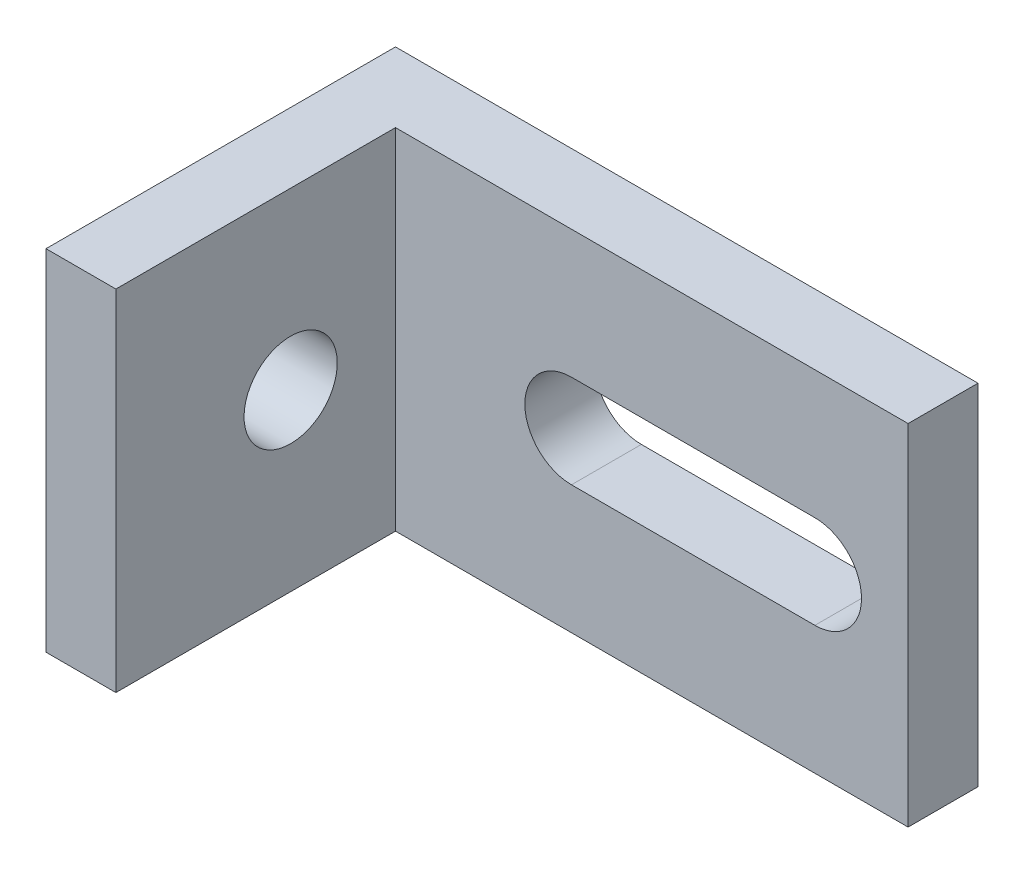
ISO-10303-21;
HEADER;
FILE_DESCRIPTION(('STEP AP214'),'2;1');
FILE_NAME('part.step','',(''),(''),'','','');
FILE_SCHEMA(('AUTOMOTIVE_DESIGN { 1 0 10303 214 1 1 1 1 }'));
ENDSEC;
DATA;
#1=APPLICATION_CONTEXT('core data for automotive mechanical design processes');
#2=APPLICATION_PROTOCOL_DEFINITION('international standard','automotive_design',2000,#1);
#3=PRODUCT_CONTEXT('',#1,'mechanical');
#4=PRODUCT('Part','Part','',(#3));
#5=PRODUCT_RELATED_PRODUCT_CATEGORY('part','',(#4));
#6=PRODUCT_DEFINITION_FORMATION('','',#4);
#7=PRODUCT_DEFINITION_CONTEXT('part definition',#1,'design');
#8=PRODUCT_DEFINITION('design','',#6,#7);
#9=PRODUCT_DEFINITION_SHAPE('','',#8);
#10=(LENGTH_UNIT() NAMED_UNIT(*) SI_UNIT(.MILLI.,.METRE.));
#11=(NAMED_UNIT(*) PLANE_ANGLE_UNIT() SI_UNIT($,.RADIAN.));
#12=(NAMED_UNIT(*) SI_UNIT($,.STERADIAN.) SOLID_ANGLE_UNIT());
#13=UNCERTAINTY_MEASURE_WITH_UNIT(LENGTH_MEASURE(1.E-05),#10,'distance_accuracy_value','');
#14=(GEOMETRIC_REPRESENTATION_CONTEXT(3) GLOBAL_UNCERTAINTY_ASSIGNED_CONTEXT((#13)) GLOBAL_UNIT_ASSIGNED_CONTEXT((#10,
#11,#12)) REPRESENTATION_CONTEXT('',''));
#15=CARTESIAN_POINT('',(0.,0.,0.));
#16=DIRECTION('',(0.,0.,1.));
#17=DIRECTION('',(1.,0.,0.));
#18=AXIS2_PLACEMENT_3D('',#15,#16,#17);
#19=CARTESIAN_POINT('',(12.5,7.5,3.));
#20=DIRECTION('',(-1.,0.,0.));
#21=DIRECTION('',(0.,-1.,0.));
#22=AXIS2_PLACEMENT_3D('',#19,#20,#21);
#23=PLANE('',#22);
#24=DIRECTION('',(0.,1.,0.));
#25=VECTOR('',#24,1.);
#26=CARTESIAN_POINT('',(12.5,7.5,0.));
#27=LINE('',#26,#25);
#28=CARTESIAN_POINT('',(12.5,-7.5,0.));
#29=VERTEX_POINT('',#28);
#30=CARTESIAN_POINT('',(12.5,7.5,0.));
#31=VERTEX_POINT('',#30);
#32=EDGE_CURVE('E172',#29,#31,#27,.T.);
#33=ORIENTED_EDGE('',*,*,#32,.T.);
#34=DIRECTION('',(0.,0.,-1.));
#35=VECTOR('',#34,1.);
#36=CARTESIAN_POINT('',(12.5,7.5,3.));
#37=LINE('',#36,#35);
#38=CARTESIAN_POINT('',(12.5,7.5,3.));
#39=VERTEX_POINT('',#38);
#40=EDGE_CURVE('E11',#39,#31,#37,.T.);
#41=ORIENTED_EDGE('',*,*,#40,.F.);
#42=DIRECTION('',(0.,1.,0.));
#43=VECTOR('',#42,1.);
#44=CARTESIAN_POINT('',(12.5,7.5,3.));
#45=LINE('',#44,#43);
#46=CARTESIAN_POINT('',(12.5,-7.5,3.));
#47=VERTEX_POINT('',#46);
#48=EDGE_CURVE('E178',#47,#39,#45,.T.);
#49=ORIENTED_EDGE('',*,*,#48,.F.);
#50=DIRECTION('',(0.,0.,-1.));
#51=VECTOR('',#50,1.);
#52=CARTESIAN_POINT('',(12.5,-7.5,3.));
#53=LINE('',#52,#51);
#54=EDGE_CURVE('E121',#47,#29,#53,.T.);
#55=ORIENTED_EDGE('',*,*,#54,.T.);
#56=EDGE_LOOP('',(#33,#41,#49,#55));
#57=FACE_BOUND('',#56,.T.);
#58=ADVANCED_FACE('F34',(#57),#23,.F.);
#59=CARTESIAN_POINT('',(-12.5,7.5,3.));
#60=DIRECTION('',(0.,-1.,0.));
#61=DIRECTION('',(0.,0.,-1.));
#62=AXIS2_PLACEMENT_3D('',#59,#60,#61);
#63=PLANE('',#62);
#64=DIRECTION('',(-1.,0.,0.));
#65=VECTOR('',#64,1.);
#66=CARTESIAN_POINT('',(-12.5,7.5,0.));
#67=LINE('',#66,#65);
#68=CARTESIAN_POINT('',(-12.5,7.5,0.));
#69=VERTEX_POINT('',#68);
#70=EDGE_CURVE('E188',#31,#69,#67,.T.);
#71=ORIENTED_EDGE('',*,*,#70,.T.);
#72=DIRECTION('',(0.,0.,-1.));
#73=VECTOR('',#72,1.);
#74=CARTESIAN_POINT('',(-12.5,7.5,3.));
#75=LINE('',#74,#73);
#76=CARTESIAN_POINT('',(-12.5,7.5,15.));
#77=VERTEX_POINT('',#76);
#78=EDGE_CURVE('E42',#77,#69,#75,.T.);
#79=ORIENTED_EDGE('',*,*,#78,.F.);
#80=DIRECTION('',(-1.,0.,0.));
#81=VECTOR('',#80,1.);
#82=CARTESIAN_POINT('',(-12.5,7.5,15.));
#83=LINE('',#82,#81);
#84=CARTESIAN_POINT('',(-9.5,7.5,15.));
#85=VERTEX_POINT('',#84);
#86=EDGE_CURVE('E135',#85,#77,#83,.T.);
#87=ORIENTED_EDGE('',*,*,#86,.F.);
#88=DIRECTION('',(0.,0.,-1.));
#89=VECTOR('',#88,1.);
#90=CARTESIAN_POINT('',(-9.5,7.5,15.));
#91=LINE('',#90,#89);
#92=CARTESIAN_POINT('',(-9.5,7.5,3.));
#93=VERTEX_POINT('',#92);
#94=EDGE_CURVE('E142',#85,#93,#91,.T.);
#95=ORIENTED_EDGE('',*,*,#94,.T.);
#96=DIRECTION('',(-1.,0.,0.));
#97=VECTOR('',#96,1.);
#98=CARTESIAN_POINT('',(-12.5,7.5,3.));
#99=LINE('',#98,#97);
#100=EDGE_CURVE('E181',#39,#93,#99,.T.);
#101=ORIENTED_EDGE('',*,*,#100,.F.);
#102=ORIENTED_EDGE('',*,*,#40,.T.);
#103=EDGE_LOOP('',(#71,#79,#87,#95,#101,#102));
#104=FACE_BOUND('',#103,.T.);
#105=ADVANCED_FACE('F207',(#104),#63,.F.);
#106=CARTESIAN_POINT('',(-12.5,7.5,3.));
#107=DIRECTION('',(1.,0.,0.));
#108=DIRECTION('',(0.,1.,0.));
#109=AXIS2_PLACEMENT_3D('',#106,#107,#108);
#110=PLANE('',#109);
#111=CARTESIAN_POINT('',(-12.5,0.,7.5));
#112=DIRECTION('',(-1.,0.,0.));
#113=DIRECTION('',(0.,-1.,0.));
#114=AXIS2_PLACEMENT_3D('',#111,#112,#113);
#115=CIRCLE('',#114,2.);
#116=CARTESIAN_POINT('',(-12.5,-2.,7.5));
#117=VERTEX_POINT('',#116);
#118=EDGE_CURVE('E139',#117,#117,#115,.T.);
#119=ORIENTED_EDGE('',*,*,#118,.F.);
#120=EDGE_LOOP('',(#119));
#121=FACE_BOUND('',#120,.T.);
#122=DIRECTION('',(0.,-1.,0.));
#123=VECTOR('',#122,1.);
#124=CARTESIAN_POINT('',(-12.5,7.5,0.));
#125=LINE('',#124,#123);
#126=CARTESIAN_POINT('',(-12.5,-7.5,0.));
#127=VERTEX_POINT('',#126);
#128=EDGE_CURVE('E118',#69,#127,#125,.T.);
#129=ORIENTED_EDGE('',*,*,#128,.T.);
#130=DIRECTION('',(0.,0.,-1.));
#131=VECTOR('',#130,1.);
#132=CARTESIAN_POINT('',(-12.5,-7.5,3.));
#133=LINE('',#132,#131);
#134=CARTESIAN_POINT('',(-12.5,-7.5,15.));
#135=VERTEX_POINT('',#134);
#136=EDGE_CURVE('E111',#135,#127,#133,.T.);
#137=ORIENTED_EDGE('',*,*,#136,.F.);
#138=DIRECTION('',(0.,-1.,0.));
#139=VECTOR('',#138,1.);
#140=CARTESIAN_POINT('',(-12.5,7.5,15.));
#141=LINE('',#140,#139);
#142=EDGE_CURVE('E116',#77,#135,#141,.T.);
#143=ORIENTED_EDGE('',*,*,#142,.F.);
#144=ORIENTED_EDGE('',*,*,#78,.T.);
#145=EDGE_LOOP('',(#129,#137,#143,#144));
#146=FACE_BOUND('',#145,.T.);
#147=ADVANCED_FACE('F113',(#121,#146),#110,.F.);
#148=CARTESIAN_POINT('',(-12.5,-7.5,3.));
#149=DIRECTION('',(0.,1.,0.));
#150=DIRECTION('',(0.,0.,1.));
#151=AXIS2_PLACEMENT_3D('',#148,#149,#150);
#152=PLANE('',#151);
#153=DIRECTION('',(1.,0.,0.));
#154=VECTOR('',#153,1.);
#155=CARTESIAN_POINT('',(-12.5,-7.5,0.));
#156=LINE('',#155,#154);
#157=EDGE_CURVE('E182',#127,#29,#156,.T.);
#158=ORIENTED_EDGE('',*,*,#157,.T.);
#159=ORIENTED_EDGE('',*,*,#54,.F.);
#160=DIRECTION('',(1.,0.,0.));
#161=VECTOR('',#160,1.);
#162=CARTESIAN_POINT('',(-12.5,-7.5,3.));
#163=LINE('',#162,#161);
#164=CARTESIAN_POINT('',(-9.5,-7.5,3.));
#165=VERTEX_POINT('',#164);
#166=EDGE_CURVE('E184',#165,#47,#163,.T.);
#167=ORIENTED_EDGE('',*,*,#166,.F.);
#168=DIRECTION('',(0.,0.,-1.));
#169=VECTOR('',#168,1.);
#170=CARTESIAN_POINT('',(-9.5,-7.5,15.));
#171=LINE('',#170,#169);
#172=CARTESIAN_POINT('',(-9.5,-7.5,15.));
#173=VERTEX_POINT('',#172);
#174=EDGE_CURVE('E127',#173,#165,#171,.T.);
#175=ORIENTED_EDGE('',*,*,#174,.F.);
#176=DIRECTION('',(1.,0.,0.));
#177=VECTOR('',#176,1.);
#178=CARTESIAN_POINT('',(-12.5,-7.5,15.));
#179=LINE('',#178,#177);
#180=EDGE_CURVE('E124',#135,#173,#179,.T.);
#181=ORIENTED_EDGE('',*,*,#180,.F.);
#182=ORIENTED_EDGE('',*,*,#136,.T.);
#183=EDGE_LOOP('',(#158,#159,#167,#175,#181,#182));
#184=FACE_BOUND('',#183,.T.);
#185=ADVANCED_FACE('F125',(#184),#152,.F.);
#186=CARTESIAN_POINT('',(0.,0.,3.));
#187=DIRECTION('',(0.,0.,1.));
#188=DIRECTION('',(1.,0.,0.));
#189=AXIS2_PLACEMENT_3D('',#186,#187,#188);
#190=PLANE('',#189);
#191=DIRECTION('',(0.,1.,0.));
#192=VECTOR('',#191,1.);
#193=CARTESIAN_POINT('',(-9.5,7.5,3.));
#194=LINE('',#193,#192);
#195=EDGE_CURVE('E49',#165,#93,#194,.T.);
#196=ORIENTED_EDGE('',*,*,#195,.F.);
#197=ORIENTED_EDGE('',*,*,#166,.T.);
#198=ORIENTED_EDGE('',*,*,#48,.T.);
#199=ORIENTED_EDGE('',*,*,#100,.T.);
#200=EDGE_LOOP('',(#196,#197,#198,#199));
#201=FACE_BOUND('',#200,.T.);
#202=CARTESIAN_POINT('',(8.5,0.,3.));
#203=DIRECTION('',(0.,0.,1.));
#204=DIRECTION('',(1.,0.,0.));
#205=AXIS2_PLACEMENT_3D('',#202,#203,#204);
#206=CIRCLE('',#205,2.);
#207=CARTESIAN_POINT('',(8.5,-2.,3.));
#208=VERTEX_POINT('',#207);
#209=CARTESIAN_POINT('',(8.5,2.,3.));
#210=VERTEX_POINT('',#209);
#211=EDGE_CURVE('E57',#208,#210,#206,.T.);
#212=ORIENTED_EDGE('',*,*,#211,.F.);
#213=DIRECTION('',(1.,0.,0.));
#214=VECTOR('',#213,1.);
#215=CARTESIAN_POINT('',(8.5,-2.,3.));
#216=LINE('',#215,#214);
#217=CARTESIAN_POINT('',(-1.94741308491374,-2.,3.));
#218=VERTEX_POINT('',#217);
#219=EDGE_CURVE('E151',#218,#208,#216,.T.);
#220=ORIENTED_EDGE('',*,*,#219,.F.);
#221=CARTESIAN_POINT('',(-1.94741308491374,0.,3.));
#222=DIRECTION('',(0.,0.,1.));
#223=DIRECTION('',(1.,0.,0.));
#224=AXIS2_PLACEMENT_3D('',#221,#222,#223);
#225=CIRCLE('',#224,2.);
#226=CARTESIAN_POINT('',(-1.94741308491374,2.,3.));
#227=VERTEX_POINT('',#226);
#228=EDGE_CURVE('E165',#227,#218,#225,.T.);
#229=ORIENTED_EDGE('',*,*,#228,.F.);
#230=DIRECTION('',(-1.,0.,0.));
#231=VECTOR('',#230,1.);
#232=CARTESIAN_POINT('',(8.5,2.,3.));
#233=LINE('',#232,#231);
#234=EDGE_CURVE('E162',#210,#227,#233,.T.);
#235=ORIENTED_EDGE('',*,*,#234,.F.);
#236=EDGE_LOOP('',(#212,#220,#229,#235));
#237=FACE_BOUND('',#236,.T.);
#238=ADVANCED_FACE('F202',(#201,#237),#190,.T.);
#239=CARTESIAN_POINT('',(0.,0.,0.));
#240=DIRECTION('',(0.,0.,1.));
#241=DIRECTION('',(1.,0.,0.));
#242=AXIS2_PLACEMENT_3D('',#239,#240,#241);
#243=PLANE('',#242);
#244=DIRECTION('',(1.,0.,0.));
#245=VECTOR('',#244,1.);
#246=CARTESIAN_POINT('',(8.5,-2.,0.));
#247=LINE('',#246,#245);
#248=CARTESIAN_POINT('',(-1.94741308491374,-2.,0.));
#249=VERTEX_POINT('',#248);
#250=CARTESIAN_POINT('',(8.5,-2.,0.));
#251=VERTEX_POINT('',#250);
#252=EDGE_CURVE('E157',#249,#251,#247,.T.);
#253=ORIENTED_EDGE('',*,*,#252,.T.);
#254=CARTESIAN_POINT('',(8.5,0.,0.));
#255=DIRECTION('',(0.,0.,1.));
#256=DIRECTION('',(1.,0.,0.));
#257=AXIS2_PLACEMENT_3D('',#254,#255,#256);
#258=CIRCLE('',#257,2.);
#259=CARTESIAN_POINT('',(8.5,2.,0.));
#260=VERTEX_POINT('',#259);
#261=EDGE_CURVE('E147',#251,#260,#258,.T.);
#262=ORIENTED_EDGE('',*,*,#261,.T.);
#263=DIRECTION('',(-1.,0.,0.));
#264=VECTOR('',#263,1.);
#265=CARTESIAN_POINT('',(8.5,2.,0.));
#266=LINE('',#265,#264);
#267=CARTESIAN_POINT('',(-1.94741308491374,2.,0.));
#268=VERTEX_POINT('',#267);
#269=EDGE_CURVE('E150',#260,#268,#266,.T.);
#270=ORIENTED_EDGE('',*,*,#269,.T.);
#271=CARTESIAN_POINT('',(-1.94741308491374,0.,0.));
#272=DIRECTION('',(0.,0.,1.));
#273=DIRECTION('',(1.,0.,0.));
#274=AXIS2_PLACEMENT_3D('',#271,#272,#273);
#275=CIRCLE('',#274,2.);
#276=EDGE_CURVE('E154',#268,#249,#275,.T.);
#277=ORIENTED_EDGE('',*,*,#276,.T.);
#278=EDGE_LOOP('',(#253,#262,#270,#277));
#279=FACE_BOUND('',#278,.T.);
#280=ORIENTED_EDGE('',*,*,#32,.F.);
#281=ORIENTED_EDGE('',*,*,#157,.F.);
#282=ORIENTED_EDGE('',*,*,#128,.F.);
#283=ORIENTED_EDGE('',*,*,#70,.F.);
#284=EDGE_LOOP('',(#280,#281,#282,#283));
#285=FACE_BOUND('',#284,.T.);
#286=ADVANCED_FACE('F197',(#279,#285),#243,.F.);
#287=CARTESIAN_POINT('',(8.5,0.,0.));
#288=DIRECTION('',(0.,0.,1.));
#289=DIRECTION('',(1.,0.,0.));
#290=AXIS2_PLACEMENT_3D('',#287,#288,#289);
#291=CYLINDRICAL_SURFACE('',#290,2.);
#292=ORIENTED_EDGE('',*,*,#211,.T.);
#293=DIRECTION('',(0.,0.,1.));
#294=VECTOR('',#293,1.);
#295=CARTESIAN_POINT('',(8.5,2.,0.));
#296=LINE('',#295,#294);
#297=EDGE_CURVE('E160',#260,#210,#296,.T.);
#298=ORIENTED_EDGE('',*,*,#297,.F.);
#299=ORIENTED_EDGE('',*,*,#261,.F.);
#300=DIRECTION('',(0.,0.,1.));
#301=VECTOR('',#300,1.);
#302=CARTESIAN_POINT('',(8.5,-2.,0.));
#303=LINE('',#302,#301);
#304=EDGE_CURVE('E170',#251,#208,#303,.T.);
#305=ORIENTED_EDGE('',*,*,#304,.T.);
#306=EDGE_LOOP('',(#292,#298,#299,#305));
#307=FACE_BOUND('',#306,.T.);
#308=ADVANCED_FACE('F220',(#307),#291,.F.);
#309=CARTESIAN_POINT('',(8.5,-2.,0.));
#310=DIRECTION('',(0.,-1.,0.));
#311=DIRECTION('',(1.,0.,0.));
#312=AXIS2_PLACEMENT_3D('',#309,#310,#311);
#313=PLANE('',#312);
#314=ORIENTED_EDGE('',*,*,#219,.T.);
#315=ORIENTED_EDGE('',*,*,#304,.F.);
#316=ORIENTED_EDGE('',*,*,#252,.F.);
#317=DIRECTION('',(0.,0.,1.));
#318=VECTOR('',#317,1.);
#319=CARTESIAN_POINT('',(-1.94741308491374,-2.,0.));
#320=LINE('',#319,#318);
#321=EDGE_CURVE('E173',#249,#218,#320,.T.);
#322=ORIENTED_EDGE('',*,*,#321,.T.);
#323=EDGE_LOOP('',(#314,#315,#316,#322));
#324=FACE_BOUND('',#323,.T.);
#325=ADVANCED_FACE('F226',(#324),#313,.F.);
#326=CARTESIAN_POINT('',(-1.94741308491374,0.,0.));
#327=DIRECTION('',(0.,0.,1.));
#328=DIRECTION('',(1.,0.,0.));
#329=AXIS2_PLACEMENT_3D('',#326,#327,#328);
#330=CYLINDRICAL_SURFACE('',#329,2.);
#331=ORIENTED_EDGE('',*,*,#228,.T.);
#332=ORIENTED_EDGE('',*,*,#321,.F.);
#333=ORIENTED_EDGE('',*,*,#276,.F.);
#334=DIRECTION('',(0.,0.,1.));
#335=VECTOR('',#334,1.);
#336=CARTESIAN_POINT('',(-1.94741308491374,2.,0.));
#337=LINE('',#336,#335);
#338=EDGE_CURVE('E175',#268,#227,#337,.T.);
#339=ORIENTED_EDGE('',*,*,#338,.T.);
#340=EDGE_LOOP('',(#331,#332,#333,#339));
#341=FACE_BOUND('',#340,.T.);
#342=ADVANCED_FACE('F230',(#341),#330,.F.);
#343=CARTESIAN_POINT('',(8.5,2.,0.));
#344=DIRECTION('',(0.,1.,0.));
#345=DIRECTION('',(-1.,0.,0.));
#346=AXIS2_PLACEMENT_3D('',#343,#344,#345);
#347=PLANE('',#346);
#348=ORIENTED_EDGE('',*,*,#234,.T.);
#349=ORIENTED_EDGE('',*,*,#338,.F.);
#350=ORIENTED_EDGE('',*,*,#269,.F.);
#351=ORIENTED_EDGE('',*,*,#297,.T.);
#352=EDGE_LOOP('',(#348,#349,#350,#351));
#353=FACE_BOUND('',#352,.T.);
#354=ADVANCED_FACE('F227',(#353),#347,.F.);
#355=CARTESIAN_POINT('',(-9.5,7.5,15.));
#356=DIRECTION('',(-1.,0.,0.));
#357=DIRECTION('',(0.,-1.,0.));
#358=AXIS2_PLACEMENT_3D('',#355,#356,#357);
#359=PLANE('',#358);
#360=CARTESIAN_POINT('',(-9.5,0.,7.5));
#361=DIRECTION('',(-1.,0.,0.));
#362=DIRECTION('',(0.,-1.,0.));
#363=AXIS2_PLACEMENT_3D('',#360,#361,#362);
#364=CIRCLE('',#363,2.);
#365=CARTESIAN_POINT('',(-9.5,-2.,7.5));
#366=VERTEX_POINT('',#365);
#367=EDGE_CURVE('E37',#366,#366,#364,.T.);
#368=ORIENTED_EDGE('',*,*,#367,.T.);
#369=EDGE_LOOP('',(#368));
#370=FACE_BOUND('',#369,.T.);
#371=ORIENTED_EDGE('',*,*,#195,.T.);
#372=ORIENTED_EDGE('',*,*,#94,.F.);
#373=DIRECTION('',(0.,1.,0.));
#374=VECTOR('',#373,1.);
#375=CARTESIAN_POINT('',(-9.5,7.5,15.));
#376=LINE('',#375,#374);
#377=EDGE_CURVE('E130',#173,#85,#376,.T.);
#378=ORIENTED_EDGE('',*,*,#377,.F.);
#379=ORIENTED_EDGE('',*,*,#174,.T.);
#380=EDGE_LOOP('',(#371,#372,#378,#379));
#381=FACE_BOUND('',#380,.T.);
#382=ADVANCED_FACE('F205',(#370,#381),#359,.F.);
#383=CARTESIAN_POINT('',(0.,0.,15.));
#384=DIRECTION('',(0.,0.,1.));
#385=DIRECTION('',(1.,0.,0.));
#386=AXIS2_PLACEMENT_3D('',#383,#384,#385);
#387=PLANE('',#386);
#388=ORIENTED_EDGE('',*,*,#142,.T.);
#389=ORIENTED_EDGE('',*,*,#180,.T.);
#390=ORIENTED_EDGE('',*,*,#377,.T.);
#391=ORIENTED_EDGE('',*,*,#86,.T.);
#392=EDGE_LOOP('',(#388,#389,#390,#391));
#393=FACE_BOUND('',#392,.T.);
#394=ADVANCED_FACE('F133',(#393),#387,.T.);
#395=CARTESIAN_POINT('',(-0.499999999999999,0.,7.5));
#396=DIRECTION('',(-1.,0.,0.));
#397=DIRECTION('',(0.,-1.,0.));
#398=AXIS2_PLACEMENT_3D('',#395,#396,#397);
#399=CYLINDRICAL_SURFACE('',#398,2.);
#400=ORIENTED_EDGE('',*,*,#118,.T.);
#401=EDGE_LOOP('',(#400));
#402=FACE_BOUND('',#401,.T.);
#403=ORIENTED_EDGE('',*,*,#367,.F.);
#404=EDGE_LOOP('',(#403));
#405=FACE_BOUND('',#404,.T.);
#406=ADVANCED_FACE('F243',(#402,#405),#399,.F.);
#407=CLOSED_SHELL('',(#58,#105,#147,#185,#238,#286,#308,#325,#342,#354,#382,#394,#406));
#408=MANIFOLD_SOLID_BREP('B2',#407);
#409=ADVANCED_BREP_SHAPE_REPRESENTATION('',(#18,#408),#14);
#410=SHAPE_DEFINITION_REPRESENTATION(#9,#409);
ENDSEC;
END-ISO-10303-21;
